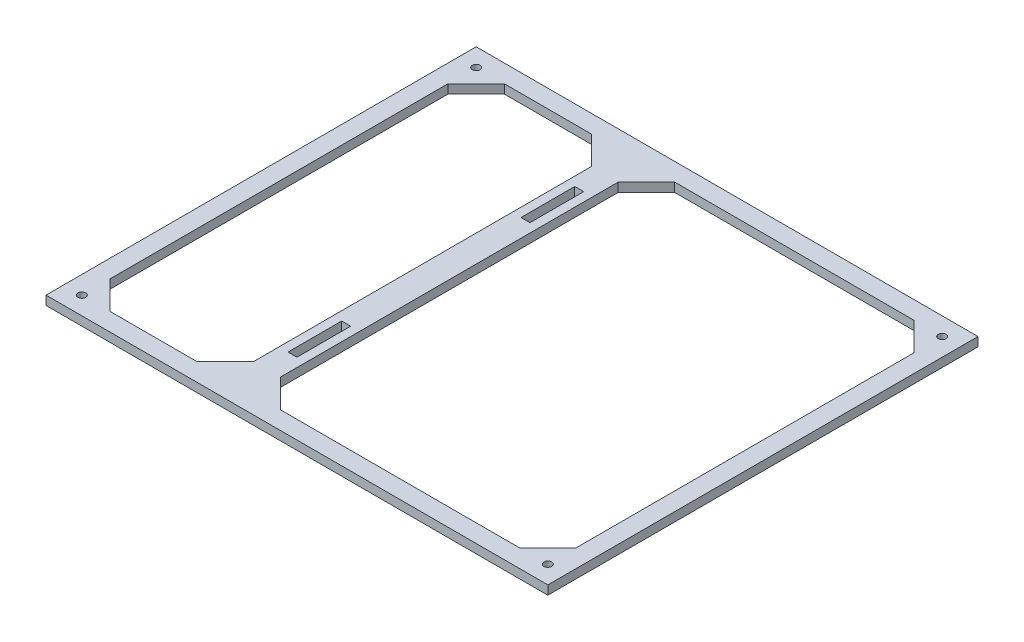
ISO-10303-21;
HEADER;
FILE_DESCRIPTION(('STEP AP214'),'2;1');
FILE_NAME('part.step','',(''),(''),'','','');
FILE_SCHEMA(('AUTOMOTIVE_DESIGN { 1 0 10303 214 1 1 1 1 }'));
ENDSEC;
DATA;
#1=APPLICATION_CONTEXT('core data for automotive mechanical design processes');
#2=APPLICATION_PROTOCOL_DEFINITION('international standard','automotive_design',2000,#1);
#3=PRODUCT_CONTEXT('',#1,'mechanical');
#4=PRODUCT('Part','Part','',(#3));
#5=PRODUCT_RELATED_PRODUCT_CATEGORY('part','',(#4));
#6=PRODUCT_DEFINITION_FORMATION('','',#4);
#7=PRODUCT_DEFINITION_CONTEXT('part definition',#1,'design');
#8=PRODUCT_DEFINITION('design','',#6,#7);
#9=PRODUCT_DEFINITION_SHAPE('','',#8);
#10=(LENGTH_UNIT() NAMED_UNIT(*) SI_UNIT(.MILLI.,.METRE.));
#11=(NAMED_UNIT(*) PLANE_ANGLE_UNIT() SI_UNIT($,.RADIAN.));
#12=(NAMED_UNIT(*) SI_UNIT($,.STERADIAN.) SOLID_ANGLE_UNIT());
#13=UNCERTAINTY_MEASURE_WITH_UNIT(LENGTH_MEASURE(1.E-05),#10,'distance_accuracy_value','');
#14=(GEOMETRIC_REPRESENTATION_CONTEXT(3) GLOBAL_UNCERTAINTY_ASSIGNED_CONTEXT((#13)) GLOBAL_UNIT_ASSIGNED_CONTEXT((#10,
#11,#12)) REPRESENTATION_CONTEXT('',''));
#15=CARTESIAN_POINT('',(0.,0.,0.));
#16=DIRECTION('',(0.,0.,1.));
#17=DIRECTION('',(1.,0.,0.));
#18=AXIS2_PLACEMENT_3D('',#15,#16,#17);
#19=CARTESIAN_POINT('',(0.,3.175,0.));
#20=DIRECTION('',(0.,-1.,0.));
#21=DIRECTION('',(0.,0.,-1.));
#22=AXIS2_PLACEMENT_3D('',#19,#20,#21);
#23=PLANE('',#22);
#24=CARTESIAN_POINT('',(6.35,3.175,-146.05));
#25=DIRECTION('',(0.,1.,0.));
#26=DIRECTION('',(0.,0.,1.));
#27=AXIS2_PLACEMENT_3D('',#24,#25,#26);
#28=CIRCLE('',#27,1.375);
#29=CARTESIAN_POINT('',(6.35,3.175,-144.675));
#30=VERTEX_POINT('',#29);
#31=EDGE_CURVE('E257',#30,#30,#28,.T.);
#32=ORIENTED_EDGE('',*,*,#31,.F.);
#33=EDGE_LOOP('',(#32));
#34=FACE_BOUND('',#33,.T.);
#35=DIRECTION('',(0.707106781186547,0.,0.707106781186548));
#36=VECTOR('',#35,1.);
#37=CARTESIAN_POINT('',(66.675,3.175,-16.35));
#38=LINE('',#37,#36);
#39=CARTESIAN_POINT('',(66.675,3.175,-16.35));
#40=VERTEX_POINT('',#39);
#41=CARTESIAN_POINT('',(76.675,3.175,-6.35000000000002));
#42=VERTEX_POINT('',#41);
#43=EDGE_CURVE('E263',#40,#42,#38,.T.);
#44=ORIENTED_EDGE('',*,*,#43,.F.);
#45=DIRECTION('',(0.,0.,1.));
#46=VECTOR('',#45,1.);
#47=CARTESIAN_POINT('',(66.675,3.175,-136.05));
#48=LINE('',#47,#46);
#49=CARTESIAN_POINT('',(66.675,3.175,-136.05));
#50=VERTEX_POINT('',#49);
#51=EDGE_CURVE('E279',#50,#40,#48,.T.);
#52=ORIENTED_EDGE('',*,*,#51,.F.);
#53=DIRECTION('',(-0.707106781186547,0.,0.707106781186549));
#54=VECTOR('',#53,1.);
#55=CARTESIAN_POINT('',(66.675,3.175,-136.05));
#56=LINE('',#55,#54);
#57=CARTESIAN_POINT('',(76.675,3.175,-146.05));
#58=VERTEX_POINT('',#57);
#59=EDGE_CURVE('E276',#58,#50,#56,.T.);
#60=ORIENTED_EDGE('',*,*,#59,.F.);
#61=DIRECTION('',(-1.,0.,0.));
#62=VECTOR('',#61,1.);
#63=CARTESIAN_POINT('',(76.675,3.175,-146.05));
#64=LINE('',#63,#62);
#65=CARTESIAN_POINT('',(161.45,3.175,-146.05));
#66=VERTEX_POINT('',#65);
#67=EDGE_CURVE('E274',#66,#58,#64,.T.);
#68=ORIENTED_EDGE('',*,*,#67,.F.);
#69=DIRECTION('',(-0.707106781186549,0.,-0.707106781186545));
#70=VECTOR('',#69,1.);
#71=CARTESIAN_POINT('',(161.45,3.175,-146.05));
#72=LINE('',#71,#70);
#73=CARTESIAN_POINT('',(171.45,3.175,-136.05));
#74=VERTEX_POINT('',#73);
#75=EDGE_CURVE('E272',#74,#66,#72,.T.);
#76=ORIENTED_EDGE('',*,*,#75,.F.);
#77=DIRECTION('',(0.,0.,-1.));
#78=VECTOR('',#77,1.);
#79=CARTESIAN_POINT('',(171.45,3.175,-136.05));
#80=LINE('',#79,#78);
#81=CARTESIAN_POINT('',(171.45,3.175,-16.35));
#82=VERTEX_POINT('',#81);
#83=EDGE_CURVE('E270',#82,#74,#80,.T.);
#84=ORIENTED_EDGE('',*,*,#83,.F.);
#85=DIRECTION('',(0.707106781186549,0.,-0.707106781186546));
#86=VECTOR('',#85,1.);
#87=CARTESIAN_POINT('',(161.45,3.175,-6.35000000000002));
#88=LINE('',#87,#86);
#89=CARTESIAN_POINT('',(161.45,3.175,-6.35000000000002));
#90=VERTEX_POINT('',#89);
#91=EDGE_CURVE('E268',#90,#82,#88,.T.);
#92=ORIENTED_EDGE('',*,*,#91,.F.);
#93=DIRECTION('',(1.,0.,0.));
#94=VECTOR('',#93,1.);
#95=CARTESIAN_POINT('',(76.675,3.175,-6.35000000000002));
#96=LINE('',#95,#94);
#97=EDGE_CURVE('E265',#42,#90,#96,.T.);
#98=ORIENTED_EDGE('',*,*,#97,.F.);
#99=EDGE_LOOP('',(#44,#52,#60,#68,#76,#84,#92,#98));
#100=FACE_BOUND('',#99,.T.);
#101=DIRECTION('',(0.,0.,1.));
#102=VECTOR('',#101,1.);
#103=CARTESIAN_POINT('',(60.325,3.175,-127.));
#104=LINE('',#103,#102);
#105=CARTESIAN_POINT('',(60.325,3.175,-127.));
#106=VERTEX_POINT('',#105);
#107=CARTESIAN_POINT('',(60.325,3.175,-107.95));
#108=VERTEX_POINT('',#107);
#109=EDGE_CURVE('E381',#106,#108,#104,.T.);
#110=ORIENTED_EDGE('',*,*,#109,.F.);
#111=DIRECTION('',(-1.,0.,0.));
#112=VECTOR('',#111,1.);
#113=CARTESIAN_POINT('',(60.325,3.175,-127.));
#114=LINE('',#113,#112);
#115=CARTESIAN_POINT('',(63.5,3.175,-127.));
#116=VERTEX_POINT('',#115);
#117=EDGE_CURVE('E389',#116,#106,#114,.T.);
#118=ORIENTED_EDGE('',*,*,#117,.F.);
#119=DIRECTION('',(0.,0.,-1.));
#120=VECTOR('',#119,1.);
#121=CARTESIAN_POINT('',(63.5,3.175,-127.));
#122=LINE('',#121,#120);
#123=CARTESIAN_POINT('',(63.5,3.175,-107.95));
#124=VERTEX_POINT('',#123);
#125=EDGE_CURVE('E386',#124,#116,#122,.T.);
#126=ORIENTED_EDGE('',*,*,#125,.F.);
#127=DIRECTION('',(1.,0.,0.));
#128=VECTOR('',#127,1.);
#129=CARTESIAN_POINT('',(60.325,3.175,-107.95));
#130=LINE('',#129,#128);
#131=EDGE_CURVE('E383',#108,#124,#130,.T.);
#132=ORIENTED_EDGE('',*,*,#131,.F.);
#133=EDGE_LOOP('',(#110,#118,#126,#132));
#134=FACE_BOUND('',#133,.T.);
#135=DIRECTION('',(0.,0.,1.));
#136=VECTOR('',#135,1.);
#137=CARTESIAN_POINT('',(0.,3.175,0.));
#138=LINE('',#137,#136);
#139=CARTESIAN_POINT('',(0.,3.175,-152.4));
#140=VERTEX_POINT('',#139);
#141=CARTESIAN_POINT('',(0.,3.175,0.));
#142=VERTEX_POINT('',#141);
#143=EDGE_CURVE('E412',#140,#142,#138,.T.);
#144=ORIENTED_EDGE('',*,*,#143,.T.);
#145=DIRECTION('',(1.,0.,0.));
#146=VECTOR('',#145,1.);
#147=CARTESIAN_POINT('',(0.,3.175,0.));
#148=LINE('',#147,#146);
#149=CARTESIAN_POINT('',(177.8,3.175,0.));
#150=VERTEX_POINT('',#149);
#151=EDGE_CURVE('E415',#142,#150,#148,.T.);
#152=ORIENTED_EDGE('',*,*,#151,.T.);
#153=DIRECTION('',(0.,0.,-1.));
#154=VECTOR('',#153,1.);
#155=CARTESIAN_POINT('',(177.8,3.175,0.));
#156=LINE('',#155,#154);
#157=CARTESIAN_POINT('',(177.8,3.175,-152.4));
#158=VERTEX_POINT('',#157);
#159=EDGE_CURVE('E418',#150,#158,#156,.T.);
#160=ORIENTED_EDGE('',*,*,#159,.T.);
#161=DIRECTION('',(-1.,0.,0.));
#162=VECTOR('',#161,1.);
#163=CARTESIAN_POINT('',(0.,3.175,-152.4));
#164=LINE('',#163,#162);
#165=EDGE_CURVE('E420',#158,#140,#164,.T.);
#166=ORIENTED_EDGE('',*,*,#165,.T.);
#167=EDGE_LOOP('',(#144,#152,#160,#166));
#168=FACE_BOUND('',#167,.T.);
#169=DIRECTION('',(0.,0.,1.));
#170=VECTOR('',#169,1.);
#171=CARTESIAN_POINT('',(6.35,3.175,-136.05));
#172=LINE('',#171,#170);
#173=CARTESIAN_POINT('',(6.35,3.175,-136.05));
#174=VERTEX_POINT('',#173);
#175=CARTESIAN_POINT('',(6.35000000000002,3.175,-16.35));
#176=VERTEX_POINT('',#175);
#177=EDGE_CURVE('E322',#174,#176,#172,.T.);
#178=ORIENTED_EDGE('',*,*,#177,.F.);
#179=DIRECTION('',(-0.707106781186547,0.,0.707106781186548));
#180=VECTOR('',#179,1.);
#181=CARTESIAN_POINT('',(6.35,3.175,-136.05));
#182=LINE('',#181,#180);
#183=CARTESIAN_POINT('',(16.35,3.175,-146.05));
#184=VERTEX_POINT('',#183);
#185=EDGE_CURVE('E338',#184,#174,#182,.T.);
#186=ORIENTED_EDGE('',*,*,#185,.F.);
#187=DIRECTION('',(-1.,0.,0.));
#188=VECTOR('',#187,1.);
#189=CARTESIAN_POINT('',(16.35,3.175,-146.05));
#190=LINE('',#189,#188);
#191=CARTESIAN_POINT('',(47.15,3.175,-146.05));
#192=VERTEX_POINT('',#191);
#193=EDGE_CURVE('E335',#192,#184,#190,.T.);
#194=ORIENTED_EDGE('',*,*,#193,.F.);
#195=DIRECTION('',(-0.707106781186547,0.,-0.707106781186547));
#196=VECTOR('',#195,1.);
#197=CARTESIAN_POINT('',(47.15,3.175,-146.05));
#198=LINE('',#197,#196);
#199=CARTESIAN_POINT('',(57.15,3.175,-136.05));
#200=VERTEX_POINT('',#199);
#201=EDGE_CURVE('E333',#200,#192,#198,.T.);
#202=ORIENTED_EDGE('',*,*,#201,.F.);
#203=DIRECTION('',(0.,0.,-1.));
#204=VECTOR('',#203,1.);
#205=CARTESIAN_POINT('',(57.15,3.175,-136.05));
#206=LINE('',#205,#204);
#207=CARTESIAN_POINT('',(57.15,3.175,-16.35));
#208=VERTEX_POINT('',#207);
#209=EDGE_CURVE('E331',#208,#200,#206,.T.);
#210=ORIENTED_EDGE('',*,*,#209,.F.);
#211=DIRECTION('',(0.707106781186548,0.,-0.707106781186548));
#212=VECTOR('',#211,1.);
#213=CARTESIAN_POINT('',(47.15,3.175,-6.35000000000002));
#214=LINE('',#213,#212);
#215=CARTESIAN_POINT('',(47.15,3.175,-6.35000000000002));
#216=VERTEX_POINT('',#215);
#217=EDGE_CURVE('E329',#216,#208,#214,.T.);
#218=ORIENTED_EDGE('',*,*,#217,.F.);
#219=DIRECTION('',(1.,0.,0.));
#220=VECTOR('',#219,1.);
#221=CARTESIAN_POINT('',(16.35,3.175,-6.35000000000002));
#222=LINE('',#221,#220);
#223=CARTESIAN_POINT('',(16.35,3.175,-6.35000000000002));
#224=VERTEX_POINT('',#223);
#225=EDGE_CURVE('E327',#224,#216,#222,.T.);
#226=ORIENTED_EDGE('',*,*,#225,.F.);
#227=DIRECTION('',(0.707106781186548,0.,0.707106781186548));
#228=VECTOR('',#227,1.);
#229=CARTESIAN_POINT('',(6.35000000000002,3.175,-16.35));
#230=LINE('',#229,#228);
#231=EDGE_CURVE('E324',#176,#224,#230,.T.);
#232=ORIENTED_EDGE('',*,*,#231,.F.);
#233=EDGE_LOOP('',(#178,#186,#194,#202,#210,#218,#226,#232));
#234=FACE_BOUND('',#233,.T.);
#235=DIRECTION('',(0.,0.,1.));
#236=VECTOR('',#235,1.);
#237=CARTESIAN_POINT('',(60.325,3.175,-25.4));
#238=LINE('',#237,#236);
#239=CARTESIAN_POINT('',(60.325,3.175,-44.45));
#240=VERTEX_POINT('',#239);
#241=CARTESIAN_POINT('',(60.325,3.175,-25.4));
#242=VERTEX_POINT('',#241);
#243=EDGE_CURVE('E218',#240,#242,#238,.T.);
#244=ORIENTED_EDGE('',*,*,#243,.F.);
#245=DIRECTION('',(-1.,0.,0.));
#246=VECTOR('',#245,1.);
#247=CARTESIAN_POINT('',(60.325,3.175,-44.45));
#248=LINE('',#247,#246);
#249=CARTESIAN_POINT('',(63.5,3.175,-44.45));
#250=VERTEX_POINT('',#249);
#251=EDGE_CURVE('E241',#250,#240,#248,.T.);
#252=ORIENTED_EDGE('',*,*,#251,.F.);
#253=DIRECTION('',(0.,0.,-1.));
#254=VECTOR('',#253,1.);
#255=CARTESIAN_POINT('',(63.5,3.175,-25.4));
#256=LINE('',#255,#254);
#257=CARTESIAN_POINT('',(63.5,3.175,-25.4));
#258=VERTEX_POINT('',#257);
#259=EDGE_CURVE('E239',#258,#250,#256,.T.);
#260=ORIENTED_EDGE('',*,*,#259,.F.);
#261=DIRECTION('',(1.,0.,0.));
#262=VECTOR('',#261,1.);
#263=CARTESIAN_POINT('',(60.325,3.175,-25.4));
#264=LINE('',#263,#262);
#265=EDGE_CURVE('E226',#242,#258,#264,.T.);
#266=ORIENTED_EDGE('',*,*,#265,.F.);
#267=EDGE_LOOP('',(#244,#252,#260,#266));
#268=FACE_BOUND('',#267,.T.);
#269=CARTESIAN_POINT('',(6.35000000000002,3.175,-6.35000000000002));
#270=DIRECTION('',(0.,1.,0.));
#271=DIRECTION('',(0.,0.,1.));
#272=AXIS2_PLACEMENT_3D('',#269,#270,#271);
#273=CIRCLE('',#272,1.375);
#274=CARTESIAN_POINT('',(6.35000000000002,3.175,-4.97500000000002));
#275=VERTEX_POINT('',#274);
#276=EDGE_CURVE('E247',#275,#275,#273,.T.);
#277=ORIENTED_EDGE('',*,*,#276,.F.);
#278=EDGE_LOOP('',(#277));
#279=FACE_BOUND('',#278,.T.);
#280=CARTESIAN_POINT('',(171.45,3.175,-6.35000000000002));
#281=DIRECTION('',(0.,1.,0.));
#282=DIRECTION('',(0.,0.,1.));
#283=AXIS2_PLACEMENT_3D('',#280,#281,#282);
#284=CIRCLE('',#283,1.37499999999999);
#285=CARTESIAN_POINT('',(171.45,3.175,-4.97500000000003));
#286=VERTEX_POINT('',#285);
#287=EDGE_CURVE('E613',#286,#286,#284,.T.);
#288=ORIENTED_EDGE('',*,*,#287,.F.);
#289=EDGE_LOOP('',(#288));
#290=FACE_BOUND('',#289,.T.);
#291=CARTESIAN_POINT('',(171.45,3.175,-146.05));
#292=DIRECTION('',(0.,1.,0.));
#293=DIRECTION('',(0.,0.,1.));
#294=AXIS2_PLACEMENT_3D('',#291,#292,#293);
#295=CIRCLE('',#294,1.37499999999999);
#296=CARTESIAN_POINT('',(171.45,3.175,-144.675));
#297=VERTEX_POINT('',#296);
#298=EDGE_CURVE('E604',#297,#297,#295,.T.);
#299=ORIENTED_EDGE('',*,*,#298,.F.);
#300=EDGE_LOOP('',(#299));
#301=FACE_BOUND('',#300,.T.);
#302=ADVANCED_FACE('F33',(#34,#100,#134,#168,#234,#268,#279,#290,#301),#23,.F.);
#303=CARTESIAN_POINT('',(0.,0.,0.));
#304=DIRECTION('',(0.,-1.,0.));
#305=DIRECTION('',(0.,0.,-1.));
#306=AXIS2_PLACEMENT_3D('',#303,#304,#305);
#307=PLANE('',#306);
#308=CARTESIAN_POINT('',(171.45,0.,-6.35000000000002));
#309=DIRECTION('',(0.,1.,0.));
#310=DIRECTION('',(0.,0.,1.));
#311=AXIS2_PLACEMENT_3D('',#308,#309,#310);
#312=CIRCLE('',#311,1.37499999999999);
#313=CARTESIAN_POINT('',(171.45,0.,-4.97500000000003));
#314=VERTEX_POINT('',#313);
#315=EDGE_CURVE('E610',#314,#314,#312,.T.);
#316=ORIENTED_EDGE('',*,*,#315,.T.);
#317=EDGE_LOOP('',(#316));
#318=FACE_BOUND('',#317,.T.);
#319=DIRECTION('',(-1.,0.,0.));
#320=VECTOR('',#319,1.);
#321=CARTESIAN_POINT('',(60.325,0.,-44.45));
#322=LINE('',#321,#320);
#323=CARTESIAN_POINT('',(63.5,0.,-44.45));
#324=VERTEX_POINT('',#323);
#325=CARTESIAN_POINT('',(60.325,0.,-44.45));
#326=VERTEX_POINT('',#325);
#327=EDGE_CURVE('E227',#324,#326,#322,.T.);
#328=ORIENTED_EDGE('',*,*,#327,.T.);
#329=DIRECTION('',(0.,0.,1.));
#330=VECTOR('',#329,1.);
#331=CARTESIAN_POINT('',(60.325,0.,-25.4));
#332=LINE('',#331,#330);
#333=CARTESIAN_POINT('',(60.325,0.,-25.4));
#334=VERTEX_POINT('',#333);
#335=EDGE_CURVE('E56',#326,#334,#332,.T.);
#336=ORIENTED_EDGE('',*,*,#335,.T.);
#337=DIRECTION('',(1.,0.,0.));
#338=VECTOR('',#337,1.);
#339=CARTESIAN_POINT('',(60.325,0.,-25.4));
#340=LINE('',#339,#338);
#341=CARTESIAN_POINT('',(63.5,0.,-25.4));
#342=VERTEX_POINT('',#341);
#343=EDGE_CURVE('E233',#334,#342,#340,.T.);
#344=ORIENTED_EDGE('',*,*,#343,.T.);
#345=DIRECTION('',(0.,0.,-1.));
#346=VECTOR('',#345,1.);
#347=CARTESIAN_POINT('',(63.5,0.,-25.4));
#348=LINE('',#347,#346);
#349=EDGE_CURVE('E249',#342,#324,#348,.T.);
#350=ORIENTED_EDGE('',*,*,#349,.T.);
#351=EDGE_LOOP('',(#328,#336,#344,#350));
#352=FACE_BOUND('',#351,.T.);
#353=CARTESIAN_POINT('',(6.35,0.,-146.05));
#354=DIRECTION('',(0.,1.,0.));
#355=DIRECTION('',(0.,0.,1.));
#356=AXIS2_PLACEMENT_3D('',#353,#354,#355);
#357=CIRCLE('',#356,1.375);
#358=CARTESIAN_POINT('',(6.35,0.,-144.675));
#359=VERTEX_POINT('',#358);
#360=EDGE_CURVE('E234',#359,#359,#357,.T.);
#361=ORIENTED_EDGE('',*,*,#360,.T.);
#362=EDGE_LOOP('',(#361));
#363=FACE_BOUND('',#362,.T.);
#364=DIRECTION('',(0.,0.,1.));
#365=VECTOR('',#364,1.);
#366=CARTESIAN_POINT('',(0.,0.,0.));
#367=LINE('',#366,#365);
#368=CARTESIAN_POINT('',(0.,0.,-152.4));
#369=VERTEX_POINT('',#368);
#370=CARTESIAN_POINT('',(0.,0.,0.));
#371=VERTEX_POINT('',#370);
#372=EDGE_CURVE('E411',#369,#371,#367,.T.);
#373=ORIENTED_EDGE('',*,*,#372,.F.);
#374=DIRECTION('',(-1.,0.,0.));
#375=VECTOR('',#374,1.);
#376=CARTESIAN_POINT('',(0.,0.,-152.4));
#377=LINE('',#376,#375);
#378=CARTESIAN_POINT('',(177.8,0.,-152.4));
#379=VERTEX_POINT('',#378);
#380=EDGE_CURVE('E416',#379,#369,#377,.T.);
#381=ORIENTED_EDGE('',*,*,#380,.F.);
#382=DIRECTION('',(0.,0.,-1.));
#383=VECTOR('',#382,1.);
#384=CARTESIAN_POINT('',(177.8,0.,0.));
#385=LINE('',#384,#383);
#386=CARTESIAN_POINT('',(177.8,0.,0.));
#387=VERTEX_POINT('',#386);
#388=EDGE_CURVE('E427',#387,#379,#385,.T.);
#389=ORIENTED_EDGE('',*,*,#388,.F.);
#390=DIRECTION('',(1.,0.,0.));
#391=VECTOR('',#390,1.);
#392=CARTESIAN_POINT('',(0.,0.,0.));
#393=LINE('',#392,#391);
#394=EDGE_CURVE('E425',#371,#387,#393,.T.);
#395=ORIENTED_EDGE('',*,*,#394,.F.);
#396=EDGE_LOOP('',(#373,#381,#389,#395));
#397=FACE_BOUND('',#396,.T.);
#398=DIRECTION('',(-1.,0.,0.));
#399=VECTOR('',#398,1.);
#400=CARTESIAN_POINT('',(60.325,0.,-127.));
#401=LINE('',#400,#399);
#402=CARTESIAN_POINT('',(63.5,0.,-127.));
#403=VERTEX_POINT('',#402);
#404=CARTESIAN_POINT('',(60.325,0.,-127.));
#405=VERTEX_POINT('',#404);
#406=EDGE_CURVE('E384',#403,#405,#401,.T.);
#407=ORIENTED_EDGE('',*,*,#406,.T.);
#408=DIRECTION('',(0.,0.,1.));
#409=VECTOR('',#408,1.);
#410=CARTESIAN_POINT('',(60.325,0.,-127.));
#411=LINE('',#410,#409);
#412=CARTESIAN_POINT('',(60.325,0.,-107.95));
#413=VERTEX_POINT('',#412);
#414=EDGE_CURVE('E380',#405,#413,#411,.T.);
#415=ORIENTED_EDGE('',*,*,#414,.T.);
#416=DIRECTION('',(1.,0.,0.));
#417=VECTOR('',#416,1.);
#418=CARTESIAN_POINT('',(60.325,0.,-107.95));
#419=LINE('',#418,#417);
#420=CARTESIAN_POINT('',(63.5,0.,-107.95));
#421=VERTEX_POINT('',#420);
#422=EDGE_CURVE('E394',#413,#421,#419,.T.);
#423=ORIENTED_EDGE('',*,*,#422,.T.);
#424=DIRECTION('',(0.,0.,-1.));
#425=VECTOR('',#424,1.);
#426=CARTESIAN_POINT('',(63.5,0.,-127.));
#427=LINE('',#426,#425);
#428=EDGE_CURVE('E397',#421,#403,#427,.T.);
#429=ORIENTED_EDGE('',*,*,#428,.T.);
#430=EDGE_LOOP('',(#407,#415,#423,#429));
#431=FACE_BOUND('',#430,.T.);
#432=DIRECTION('',(-0.707106781186547,0.,0.707106781186548));
#433=VECTOR('',#432,1.);
#434=CARTESIAN_POINT('',(6.35,0.,-136.05));
#435=LINE('',#434,#433);
#436=CARTESIAN_POINT('',(16.35,0.,-146.05));
#437=VERTEX_POINT('',#436);
#438=CARTESIAN_POINT('',(6.35000000000002,0.,-136.05));
#439=VERTEX_POINT('',#438);
#440=EDGE_CURVE('E325',#437,#439,#435,.T.);
#441=ORIENTED_EDGE('',*,*,#440,.T.);
#442=DIRECTION('',(0.,0.,1.));
#443=VECTOR('',#442,1.);
#444=CARTESIAN_POINT('',(6.35,0.,-136.05));
#445=LINE('',#444,#443);
#446=CARTESIAN_POINT('',(6.35000000000002,0.,-16.35));
#447=VERTEX_POINT('',#446);
#448=EDGE_CURVE('E321',#439,#447,#445,.T.);
#449=ORIENTED_EDGE('',*,*,#448,.T.);
#450=DIRECTION('',(0.707106781186548,0.,0.707106781186548));
#451=VECTOR('',#450,1.);
#452=CARTESIAN_POINT('',(6.35000000000002,0.,-16.35));
#453=LINE('',#452,#451);
#454=CARTESIAN_POINT('',(16.35,0.,-6.35000000000002));
#455=VERTEX_POINT('',#454);
#456=EDGE_CURVE('E343',#447,#455,#453,.T.);
#457=ORIENTED_EDGE('',*,*,#456,.T.);
#458=DIRECTION('',(1.,0.,0.));
#459=VECTOR('',#458,1.);
#460=CARTESIAN_POINT('',(16.35,0.,-6.35000000000002));
#461=LINE('',#460,#459);
#462=CARTESIAN_POINT('',(47.15,0.,-6.35000000000002));
#463=VERTEX_POINT('',#462);
#464=EDGE_CURVE('E346',#455,#463,#461,.T.);
#465=ORIENTED_EDGE('',*,*,#464,.T.);
#466=DIRECTION('',(0.707106781186548,0.,-0.707106781186548));
#467=VECTOR('',#466,1.);
#468=CARTESIAN_POINT('',(47.15,0.,-6.35000000000002));
#469=LINE('',#468,#467);
#470=CARTESIAN_POINT('',(57.15,0.,-16.35));
#471=VERTEX_POINT('',#470);
#472=EDGE_CURVE('E349',#463,#471,#469,.T.);
#473=ORIENTED_EDGE('',*,*,#472,.T.);
#474=DIRECTION('',(0.,0.,-1.));
#475=VECTOR('',#474,1.);
#476=CARTESIAN_POINT('',(57.15,0.,-136.05));
#477=LINE('',#476,#475);
#478=CARTESIAN_POINT('',(57.15,0.,-136.05));
#479=VERTEX_POINT('',#478);
#480=EDGE_CURVE('E352',#471,#479,#477,.T.);
#481=ORIENTED_EDGE('',*,*,#480,.T.);
#482=DIRECTION('',(-0.707106781186547,0.,-0.707106781186547));
#483=VECTOR('',#482,1.);
#484=CARTESIAN_POINT('',(47.15,0.,-146.05));
#485=LINE('',#484,#483);
#486=CARTESIAN_POINT('',(47.15,0.,-146.05));
#487=VERTEX_POINT('',#486);
#488=EDGE_CURVE('E355',#479,#487,#485,.T.);
#489=ORIENTED_EDGE('',*,*,#488,.T.);
#490=DIRECTION('',(-1.,0.,0.));
#491=VECTOR('',#490,1.);
#492=CARTESIAN_POINT('',(16.35,0.,-146.05));
#493=LINE('',#492,#491);
#494=EDGE_CURVE('E358',#487,#437,#493,.T.);
#495=ORIENTED_EDGE('',*,*,#494,.T.);
#496=EDGE_LOOP('',(#441,#449,#457,#465,#473,#481,#489,#495));
#497=FACE_BOUND('',#496,.T.);
#498=DIRECTION('',(0.,0.,1.));
#499=VECTOR('',#498,1.);
#500=CARTESIAN_POINT('',(66.675,0.,-136.05));
#501=LINE('',#500,#499);
#502=CARTESIAN_POINT('',(66.675,0.,-136.05));
#503=VERTEX_POINT('',#502);
#504=CARTESIAN_POINT('',(66.675,0.,-16.35));
#505=VERTEX_POINT('',#504);
#506=EDGE_CURVE('E266',#503,#505,#501,.T.);
#507=ORIENTED_EDGE('',*,*,#506,.T.);
#508=DIRECTION('',(0.707106781186547,0.,0.707106781186548));
#509=VECTOR('',#508,1.);
#510=CARTESIAN_POINT('',(66.675,0.,-16.35));
#511=LINE('',#510,#509);
#512=CARTESIAN_POINT('',(76.675,0.,-6.35000000000002));
#513=VERTEX_POINT('',#512);
#514=EDGE_CURVE('E260',#505,#513,#511,.T.);
#515=ORIENTED_EDGE('',*,*,#514,.T.);
#516=DIRECTION('',(1.,0.,0.));
#517=VECTOR('',#516,1.);
#518=CARTESIAN_POINT('',(76.675,0.,-6.35000000000002));
#519=LINE('',#518,#517);
#520=CARTESIAN_POINT('',(161.45,0.,-6.35000000000002));
#521=VERTEX_POINT('',#520);
#522=EDGE_CURVE('E284',#513,#521,#519,.T.);
#523=ORIENTED_EDGE('',*,*,#522,.T.);
#524=DIRECTION('',(0.707106781186549,0.,-0.707106781186546));
#525=VECTOR('',#524,1.);
#526=CARTESIAN_POINT('',(161.45,0.,-6.35000000000002));
#527=LINE('',#526,#525);
#528=CARTESIAN_POINT('',(171.45,0.,-16.35));
#529=VERTEX_POINT('',#528);
#530=EDGE_CURVE('E287',#521,#529,#527,.T.);
#531=ORIENTED_EDGE('',*,*,#530,.T.);
#532=DIRECTION('',(0.,0.,-1.));
#533=VECTOR('',#532,1.);
#534=CARTESIAN_POINT('',(171.45,0.,-136.05));
#535=LINE('',#534,#533);
#536=CARTESIAN_POINT('',(171.45,0.,-136.05));
#537=VERTEX_POINT('',#536);
#538=EDGE_CURVE('E290',#529,#537,#535,.T.);
#539=ORIENTED_EDGE('',*,*,#538,.T.);
#540=DIRECTION('',(-0.707106781186549,0.,-0.707106781186545));
#541=VECTOR('',#540,1.);
#542=CARTESIAN_POINT('',(161.45,0.,-146.05));
#543=LINE('',#542,#541);
#544=CARTESIAN_POINT('',(161.45,0.,-146.05));
#545=VERTEX_POINT('',#544);
#546=EDGE_CURVE('E293',#537,#545,#543,.T.);
#547=ORIENTED_EDGE('',*,*,#546,.T.);
#548=DIRECTION('',(-1.,0.,0.));
#549=VECTOR('',#548,1.);
#550=CARTESIAN_POINT('',(76.675,0.,-146.05));
#551=LINE('',#550,#549);
#552=CARTESIAN_POINT('',(76.675,0.,-146.05));
#553=VERTEX_POINT('',#552);
#554=EDGE_CURVE('E296',#545,#553,#551,.T.);
#555=ORIENTED_EDGE('',*,*,#554,.T.);
#556=DIRECTION('',(-0.707106781186547,0.,0.707106781186549));
#557=VECTOR('',#556,1.);
#558=CARTESIAN_POINT('',(66.675,0.,-136.05));
#559=LINE('',#558,#557);
#560=EDGE_CURVE('E299',#553,#503,#559,.T.);
#561=ORIENTED_EDGE('',*,*,#560,.T.);
#562=EDGE_LOOP('',(#507,#515,#523,#531,#539,#547,#555,#561));
#563=FACE_BOUND('',#562,.T.);
#564=CARTESIAN_POINT('',(6.35000000000002,0.,-6.35000000000002));
#565=DIRECTION('',(0.,1.,0.));
#566=DIRECTION('',(0.,0.,1.));
#567=AXIS2_PLACEMENT_3D('',#564,#565,#566);
#568=CIRCLE('',#567,1.375);
#569=CARTESIAN_POINT('',(6.35000000000002,0.,-4.97500000000002));
#570=VERTEX_POINT('',#569);
#571=EDGE_CURVE('E616',#570,#570,#568,.T.);
#572=ORIENTED_EDGE('',*,*,#571,.T.);
#573=EDGE_LOOP('',(#572));
#574=FACE_BOUND('',#573,.T.);
#575=CARTESIAN_POINT('',(171.45,0.,-146.05));
#576=DIRECTION('',(0.,1.,0.));
#577=DIRECTION('',(0.,0.,1.));
#578=AXIS2_PLACEMENT_3D('',#575,#576,#577);
#579=CIRCLE('',#578,1.37499999999999);
#580=CARTESIAN_POINT('',(171.45,0.,-144.675));
#581=VERTEX_POINT('',#580);
#582=EDGE_CURVE('E607',#581,#581,#579,.T.);
#583=ORIENTED_EDGE('',*,*,#582,.T.);
#584=EDGE_LOOP('',(#583));
#585=FACE_BOUND('',#584,.T.);
#586=ADVANCED_FACE('F445',(#318,#352,#363,#397,#431,#497,#563,#574,#585),#307,.T.);
#587=CARTESIAN_POINT('',(0.,3.175,0.));
#588=DIRECTION('',(1.,0.,0.));
#589=DIRECTION('',(0.,0.,-1.));
#590=AXIS2_PLACEMENT_3D('',#587,#588,#589);
#591=PLANE('',#590);
#592=ORIENTED_EDGE('',*,*,#372,.T.);
#593=DIRECTION('',(0.,-1.,0.));
#594=VECTOR('',#593,1.);
#595=CARTESIAN_POINT('',(0.,3.175,0.));
#596=LINE('',#595,#594);
#597=EDGE_CURVE('E11',#142,#371,#596,.T.);
#598=ORIENTED_EDGE('',*,*,#597,.F.);
#599=ORIENTED_EDGE('',*,*,#143,.F.);
#600=DIRECTION('',(0.,-1.,0.));
#601=VECTOR('',#600,1.);
#602=CARTESIAN_POINT('',(0.,3.175,-152.4));
#603=LINE('',#602,#601);
#604=EDGE_CURVE('E422',#140,#369,#603,.T.);
#605=ORIENTED_EDGE('',*,*,#604,.T.);
#606=EDGE_LOOP('',(#592,#598,#599,#605));
#607=FACE_BOUND('',#606,.T.);
#608=ADVANCED_FACE('F35',(#607),#591,.F.);
#609=CARTESIAN_POINT('',(0.,3.175,0.));
#610=DIRECTION('',(0.,0.,-1.));
#611=DIRECTION('',(-1.,0.,0.));
#612=AXIS2_PLACEMENT_3D('',#609,#610,#611);
#613=PLANE('',#612);
#614=ORIENTED_EDGE('',*,*,#394,.T.);
#615=DIRECTION('',(0.,-1.,0.));
#616=VECTOR('',#615,1.);
#617=CARTESIAN_POINT('',(177.8,3.175,0.));
#618=LINE('',#617,#616);
#619=EDGE_CURVE('E41',#150,#387,#618,.T.);
#620=ORIENTED_EDGE('',*,*,#619,.F.);
#621=ORIENTED_EDGE('',*,*,#151,.F.);
#622=ORIENTED_EDGE('',*,*,#597,.T.);
#623=EDGE_LOOP('',(#614,#620,#621,#622));
#624=FACE_BOUND('',#623,.T.);
#625=ADVANCED_FACE('F456',(#624),#613,.F.);
#626=CARTESIAN_POINT('',(177.8,3.175,0.));
#627=DIRECTION('',(-1.,0.,0.));
#628=DIRECTION('',(0.,0.,1.));
#629=AXIS2_PLACEMENT_3D('',#626,#627,#628);
#630=PLANE('',#629);
#631=ORIENTED_EDGE('',*,*,#388,.T.);
#632=DIRECTION('',(0.,-1.,0.));
#633=VECTOR('',#632,1.);
#634=CARTESIAN_POINT('',(177.8,3.175,-152.4));
#635=LINE('',#634,#633);
#636=EDGE_CURVE('E432',#158,#379,#635,.T.);
#637=ORIENTED_EDGE('',*,*,#636,.F.);
#638=ORIENTED_EDGE('',*,*,#159,.F.);
#639=ORIENTED_EDGE('',*,*,#619,.T.);
#640=EDGE_LOOP('',(#631,#637,#638,#639));
#641=FACE_BOUND('',#640,.T.);
#642=ADVANCED_FACE('F439',(#641),#630,.F.);
#643=CARTESIAN_POINT('',(0.,3.175,-152.4));
#644=DIRECTION('',(0.,0.,1.));
#645=DIRECTION('',(1.,0.,0.));
#646=AXIS2_PLACEMENT_3D('',#643,#644,#645);
#647=PLANE('',#646);
#648=ORIENTED_EDGE('',*,*,#380,.T.);
#649=ORIENTED_EDGE('',*,*,#604,.F.);
#650=ORIENTED_EDGE('',*,*,#165,.F.);
#651=ORIENTED_EDGE('',*,*,#636,.T.);
#652=EDGE_LOOP('',(#648,#649,#650,#651));
#653=FACE_BOUND('',#652,.T.);
#654=ADVANCED_FACE('F449',(#653),#647,.F.);
#655=CARTESIAN_POINT('',(60.325,3.175,-127.));
#656=DIRECTION('',(1.,0.,0.));
#657=DIRECTION('',(0.,0.,-1.));
#658=AXIS2_PLACEMENT_3D('',#655,#656,#657);
#659=PLANE('',#658);
#660=ORIENTED_EDGE('',*,*,#414,.F.);
#661=DIRECTION('',(0.,-1.,0.));
#662=VECTOR('',#661,1.);
#663=CARTESIAN_POINT('',(60.325,3.175,-127.));
#664=LINE('',#663,#662);
#665=EDGE_CURVE('E391',#106,#405,#664,.T.);
#666=ORIENTED_EDGE('',*,*,#665,.F.);
#667=ORIENTED_EDGE('',*,*,#109,.T.);
#668=DIRECTION('',(0.,-1.,0.));
#669=VECTOR('',#668,1.);
#670=CARTESIAN_POINT('',(60.325,3.175,-107.95));
#671=LINE('',#670,#669);
#672=EDGE_CURVE('E408',#108,#413,#671,.T.);
#673=ORIENTED_EDGE('',*,*,#672,.T.);
#674=EDGE_LOOP('',(#660,#666,#667,#673));
#675=FACE_BOUND('',#674,.T.);
#676=ADVANCED_FACE('F474',(#675),#659,.T.);
#677=CARTESIAN_POINT('',(60.325,3.175,-107.95));
#678=DIRECTION('',(0.,0.,-1.));
#679=DIRECTION('',(-1.,0.,0.));
#680=AXIS2_PLACEMENT_3D('',#677,#678,#679);
#681=PLANE('',#680);
#682=ORIENTED_EDGE('',*,*,#422,.F.);
#683=ORIENTED_EDGE('',*,*,#672,.F.);
#684=ORIENTED_EDGE('',*,*,#131,.T.);
#685=DIRECTION('',(0.,-1.,0.));
#686=VECTOR('',#685,1.);
#687=CARTESIAN_POINT('',(63.5,3.175,-107.95));
#688=LINE('',#687,#686);
#689=EDGE_CURVE('E406',#124,#421,#688,.T.);
#690=ORIENTED_EDGE('',*,*,#689,.T.);
#691=EDGE_LOOP('',(#682,#683,#684,#690));
#692=FACE_BOUND('',#691,.T.);
#693=ADVANCED_FACE('F481',(#692),#681,.T.);
#694=CARTESIAN_POINT('',(63.5,3.175,-127.));
#695=DIRECTION('',(-1.,0.,0.));
#696=DIRECTION('',(0.,0.,1.));
#697=AXIS2_PLACEMENT_3D('',#694,#695,#696);
#698=PLANE('',#697);
#699=ORIENTED_EDGE('',*,*,#428,.F.);
#700=ORIENTED_EDGE('',*,*,#689,.F.);
#701=ORIENTED_EDGE('',*,*,#125,.T.);
#702=DIRECTION('',(0.,-1.,0.));
#703=VECTOR('',#702,1.);
#704=CARTESIAN_POINT('',(63.5,3.175,-127.));
#705=LINE('',#704,#703);
#706=EDGE_CURVE('E404',#116,#403,#705,.T.);
#707=ORIENTED_EDGE('',*,*,#706,.T.);
#708=EDGE_LOOP('',(#699,#700,#701,#707));
#709=FACE_BOUND('',#708,.T.);
#710=ADVANCED_FACE('F486',(#709),#698,.T.);
#711=CARTESIAN_POINT('',(60.325,3.175,-127.));
#712=DIRECTION('',(0.,0.,1.));
#713=DIRECTION('',(1.,0.,0.));
#714=AXIS2_PLACEMENT_3D('',#711,#712,#713);
#715=PLANE('',#714);
#716=ORIENTED_EDGE('',*,*,#406,.F.);
#717=ORIENTED_EDGE('',*,*,#706,.F.);
#718=ORIENTED_EDGE('',*,*,#117,.T.);
#719=ORIENTED_EDGE('',*,*,#665,.T.);
#720=EDGE_LOOP('',(#716,#717,#718,#719));
#721=FACE_BOUND('',#720,.T.);
#722=ADVANCED_FACE('F493',(#721),#715,.T.);
#723=CARTESIAN_POINT('',(6.35,3.175,-136.05));
#724=DIRECTION('',(1.,0.,0.));
#725=DIRECTION('',(0.,0.,-1.));
#726=AXIS2_PLACEMENT_3D('',#723,#724,#725);
#727=PLANE('',#726);
#728=ORIENTED_EDGE('',*,*,#448,.F.);
#729=DIRECTION('',(0.,-1.,0.));
#730=VECTOR('',#729,1.);
#731=CARTESIAN_POINT('',(6.35,3.175,-136.05));
#732=LINE('',#731,#730);
#733=EDGE_CURVE('E340',#174,#439,#732,.T.);
#734=ORIENTED_EDGE('',*,*,#733,.F.);
#735=ORIENTED_EDGE('',*,*,#177,.T.);
#736=DIRECTION('',(0.,-1.,0.));
#737=VECTOR('',#736,1.);
#738=CARTESIAN_POINT('',(6.35000000000002,3.175,-16.35));
#739=LINE('',#738,#737);
#740=EDGE_CURVE('E377',#176,#447,#739,.T.);
#741=ORIENTED_EDGE('',*,*,#740,.T.);
#742=EDGE_LOOP('',(#728,#734,#735,#741));
#743=FACE_BOUND('',#742,.T.);
#744=ADVANCED_FACE('F507',(#743),#727,.T.);
#745=CARTESIAN_POINT('',(6.35000000000002,3.175,-16.35));
#746=DIRECTION('',(0.707106781186548,0.,-0.707106781186548));
#747=DIRECTION('',(-0.707106781186548,0.,-0.707106781186548));
#748=AXIS2_PLACEMENT_3D('',#745,#746,#747);
#749=PLANE('',#748);
#750=ORIENTED_EDGE('',*,*,#456,.F.);
#751=ORIENTED_EDGE('',*,*,#740,.F.);
#752=ORIENTED_EDGE('',*,*,#231,.T.);
#753=DIRECTION('',(0.,-1.,0.));
#754=VECTOR('',#753,1.);
#755=CARTESIAN_POINT('',(16.35,3.175,-6.35000000000002));
#756=LINE('',#755,#754);
#757=EDGE_CURVE('E375',#224,#455,#756,.T.);
#758=ORIENTED_EDGE('',*,*,#757,.T.);
#759=EDGE_LOOP('',(#750,#751,#752,#758));
#760=FACE_BOUND('',#759,.T.);
#761=ADVANCED_FACE('F512',(#760),#749,.T.);
#762=CARTESIAN_POINT('',(16.35,3.175,-6.35000000000002));
#763=DIRECTION('',(0.,0.,-1.));
#764=DIRECTION('',(-1.,0.,0.));
#765=AXIS2_PLACEMENT_3D('',#762,#763,#764);
#766=PLANE('',#765);
#767=ORIENTED_EDGE('',*,*,#464,.F.);
#768=ORIENTED_EDGE('',*,*,#757,.F.);
#769=ORIENTED_EDGE('',*,*,#225,.T.);
#770=DIRECTION('',(0.,-1.,0.));
#771=VECTOR('',#770,1.);
#772=CARTESIAN_POINT('',(47.15,3.175,-6.35000000000002));
#773=LINE('',#772,#771);
#774=EDGE_CURVE('E373',#216,#463,#773,.T.);
#775=ORIENTED_EDGE('',*,*,#774,.T.);
#776=EDGE_LOOP('',(#767,#768,#769,#775));
#777=FACE_BOUND('',#776,.T.);
#778=ADVANCED_FACE('F516',(#777),#766,.T.);
#779=CARTESIAN_POINT('',(47.15,3.175,-6.35000000000002));
#780=DIRECTION('',(-0.707106781186548,0.,-0.707106781186548));
#781=DIRECTION('',(-0.707106781186548,0.,0.707106781186548));
#782=AXIS2_PLACEMENT_3D('',#779,#780,#781);
#783=PLANE('',#782);
#784=ORIENTED_EDGE('',*,*,#472,.F.);
#785=ORIENTED_EDGE('',*,*,#774,.F.);
#786=ORIENTED_EDGE('',*,*,#217,.T.);
#787=DIRECTION('',(0.,-1.,0.));
#788=VECTOR('',#787,1.);
#789=CARTESIAN_POINT('',(57.15,3.175,-16.35));
#790=LINE('',#789,#788);
#791=EDGE_CURVE('E371',#208,#471,#790,.T.);
#792=ORIENTED_EDGE('',*,*,#791,.T.);
#793=EDGE_LOOP('',(#784,#785,#786,#792));
#794=FACE_BOUND('',#793,.T.);
#795=ADVANCED_FACE('F520',(#794),#783,.T.);
#796=CARTESIAN_POINT('',(57.15,3.175,-136.05));
#797=DIRECTION('',(-1.,0.,0.));
#798=DIRECTION('',(0.,0.,1.));
#799=AXIS2_PLACEMENT_3D('',#796,#797,#798);
#800=PLANE('',#799);
#801=ORIENTED_EDGE('',*,*,#480,.F.);
#802=ORIENTED_EDGE('',*,*,#791,.F.);
#803=ORIENTED_EDGE('',*,*,#209,.T.);
#804=DIRECTION('',(0.,-1.,0.));
#805=VECTOR('',#804,1.);
#806=CARTESIAN_POINT('',(57.15,3.175,-136.05));
#807=LINE('',#806,#805);
#808=EDGE_CURVE('E369',#200,#479,#807,.T.);
#809=ORIENTED_EDGE('',*,*,#808,.T.);
#810=EDGE_LOOP('',(#801,#802,#803,#809));
#811=FACE_BOUND('',#810,.T.);
#812=ADVANCED_FACE('F524',(#811),#800,.T.);
#813=CARTESIAN_POINT('',(47.15,3.175,-146.05));
#814=DIRECTION('',(-0.707106781186548,0.,0.707106781186548));
#815=DIRECTION('',(0.707106781186548,0.,0.707106781186548));
#816=AXIS2_PLACEMENT_3D('',#813,#814,#815);
#817=PLANE('',#816);
#818=ORIENTED_EDGE('',*,*,#488,.F.);
#819=ORIENTED_EDGE('',*,*,#808,.F.);
#820=ORIENTED_EDGE('',*,*,#201,.T.);
#821=DIRECTION('',(0.,-1.,0.));
#822=VECTOR('',#821,1.);
#823=CARTESIAN_POINT('',(47.15,3.175,-146.05));
#824=LINE('',#823,#822);
#825=EDGE_CURVE('E367',#192,#487,#824,.T.);
#826=ORIENTED_EDGE('',*,*,#825,.T.);
#827=EDGE_LOOP('',(#818,#819,#820,#826));
#828=FACE_BOUND('',#827,.T.);
#829=ADVANCED_FACE('F528',(#828),#817,.T.);
#830=CARTESIAN_POINT('',(16.35,3.175,-146.05));
#831=DIRECTION('',(0.,0.,1.));
#832=DIRECTION('',(1.,0.,0.));
#833=AXIS2_PLACEMENT_3D('',#830,#831,#832);
#834=PLANE('',#833);
#835=ORIENTED_EDGE('',*,*,#494,.F.);
#836=ORIENTED_EDGE('',*,*,#825,.F.);
#837=ORIENTED_EDGE('',*,*,#193,.T.);
#838=DIRECTION('',(0.,-1.,0.));
#839=VECTOR('',#838,1.);
#840=CARTESIAN_POINT('',(16.35,3.175,-146.05));
#841=LINE('',#840,#839);
#842=EDGE_CURVE('E365',#184,#437,#841,.T.);
#843=ORIENTED_EDGE('',*,*,#842,.T.);
#844=EDGE_LOOP('',(#835,#836,#837,#843));
#845=FACE_BOUND('',#844,.T.);
#846=ADVANCED_FACE('F532',(#845),#834,.T.);
#847=CARTESIAN_POINT('',(6.35,3.175,-136.05));
#848=DIRECTION('',(0.707106781186548,0.,0.707106781186547));
#849=DIRECTION('',(0.707106781186547,0.,-0.707106781186548));
#850=AXIS2_PLACEMENT_3D('',#847,#848,#849);
#851=PLANE('',#850);
#852=ORIENTED_EDGE('',*,*,#440,.F.);
#853=ORIENTED_EDGE('',*,*,#842,.F.);
#854=ORIENTED_EDGE('',*,*,#185,.T.);
#855=ORIENTED_EDGE('',*,*,#733,.T.);
#856=EDGE_LOOP('',(#852,#853,#854,#855));
#857=FACE_BOUND('',#856,.T.);
#858=ADVANCED_FACE('F536',(#857),#851,.T.);
#859=CARTESIAN_POINT('',(66.675,3.175,-16.35));
#860=DIRECTION('',(0.707106781186548,0.,-0.707106781186547));
#861=DIRECTION('',(-0.707106781186547,0.,-0.707106781186548));
#862=AXIS2_PLACEMENT_3D('',#859,#860,#861);
#863=PLANE('',#862);
#864=ORIENTED_EDGE('',*,*,#514,.F.);
#865=DIRECTION('',(0.,-1.,0.));
#866=VECTOR('',#865,1.);
#867=CARTESIAN_POINT('',(66.675,3.175,-16.35));
#868=LINE('',#867,#866);
#869=EDGE_CURVE('E281',#40,#505,#868,.T.);
#870=ORIENTED_EDGE('',*,*,#869,.F.);
#871=ORIENTED_EDGE('',*,*,#43,.T.);
#872=DIRECTION('',(0.,-1.,0.));
#873=VECTOR('',#872,1.);
#874=CARTESIAN_POINT('',(76.675,3.175,-6.35000000000002));
#875=LINE('',#874,#873);
#876=EDGE_CURVE('E318',#42,#513,#875,.T.);
#877=ORIENTED_EDGE('',*,*,#876,.T.);
#878=EDGE_LOOP('',(#864,#870,#871,#877));
#879=FACE_BOUND('',#878,.T.);
#880=ADVANCED_FACE('F540',(#879),#863,.T.);
#881=CARTESIAN_POINT('',(76.675,3.175,-6.35000000000002));
#882=DIRECTION('',(0.,0.,-1.));
#883=DIRECTION('',(-1.,0.,0.));
#884=AXIS2_PLACEMENT_3D('',#881,#882,#883);
#885=PLANE('',#884);
#886=ORIENTED_EDGE('',*,*,#522,.F.);
#887=ORIENTED_EDGE('',*,*,#876,.F.);
#888=ORIENTED_EDGE('',*,*,#97,.T.);
#889=DIRECTION('',(0.,-1.,0.));
#890=VECTOR('',#889,1.);
#891=CARTESIAN_POINT('',(161.45,3.175,-6.35000000000002));
#892=LINE('',#891,#890);
#893=EDGE_CURVE('E316',#90,#521,#892,.T.);
#894=ORIENTED_EDGE('',*,*,#893,.T.);
#895=EDGE_LOOP('',(#886,#887,#888,#894));
#896=FACE_BOUND('',#895,.T.);
#897=ADVANCED_FACE('F544',(#896),#885,.T.);
#898=CARTESIAN_POINT('',(161.45,3.175,-6.35000000000002));
#899=DIRECTION('',(-0.707106781186546,0.,-0.707106781186549));
#900=DIRECTION('',(-0.707106781186549,0.,0.707106781186546));
#901=AXIS2_PLACEMENT_3D('',#898,#899,#900);
#902=PLANE('',#901);
#903=ORIENTED_EDGE('',*,*,#530,.F.);
#904=ORIENTED_EDGE('',*,*,#893,.F.);
#905=ORIENTED_EDGE('',*,*,#91,.T.);
#906=DIRECTION('',(0.,-1.,0.));
#907=VECTOR('',#906,1.);
#908=CARTESIAN_POINT('',(171.45,3.175,-16.35));
#909=LINE('',#908,#907);
#910=EDGE_CURVE('E314',#82,#529,#909,.T.);
#911=ORIENTED_EDGE('',*,*,#910,.T.);
#912=EDGE_LOOP('',(#903,#904,#905,#911));
#913=FACE_BOUND('',#912,.T.);
#914=ADVANCED_FACE('F548',(#913),#902,.T.);
#915=CARTESIAN_POINT('',(171.45,3.175,-136.05));
#916=DIRECTION('',(-1.,0.,0.));
#917=DIRECTION('',(0.,0.,1.));
#918=AXIS2_PLACEMENT_3D('',#915,#916,#917);
#919=PLANE('',#918);
#920=ORIENTED_EDGE('',*,*,#538,.F.);
#921=ORIENTED_EDGE('',*,*,#910,.F.);
#922=ORIENTED_EDGE('',*,*,#83,.T.);
#923=DIRECTION('',(0.,-1.,0.));
#924=VECTOR('',#923,1.);
#925=CARTESIAN_POINT('',(171.45,3.175,-136.05));
#926=LINE('',#925,#924);
#927=EDGE_CURVE('E312',#74,#537,#926,.T.);
#928=ORIENTED_EDGE('',*,*,#927,.T.);
#929=EDGE_LOOP('',(#920,#921,#922,#928));
#930=FACE_BOUND('',#929,.T.);
#931=ADVANCED_FACE('F552',(#930),#919,.T.);
#932=CARTESIAN_POINT('',(161.45,3.175,-146.05));
#933=DIRECTION('',(-0.707106781186545,0.,0.707106781186549));
#934=DIRECTION('',(0.70710678118655,0.,0.707106781186546));
#935=AXIS2_PLACEMENT_3D('',#932,#933,#934);
#936=PLANE('',#935);
#937=ORIENTED_EDGE('',*,*,#546,.F.);
#938=ORIENTED_EDGE('',*,*,#927,.F.);
#939=ORIENTED_EDGE('',*,*,#75,.T.);
#940=DIRECTION('',(0.,-1.,0.));
#941=VECTOR('',#940,1.);
#942=CARTESIAN_POINT('',(161.45,3.175,-146.05));
#943=LINE('',#942,#941);
#944=EDGE_CURVE('E310',#66,#545,#943,.T.);
#945=ORIENTED_EDGE('',*,*,#944,.T.);
#946=EDGE_LOOP('',(#937,#938,#939,#945));
#947=FACE_BOUND('',#946,.T.);
#948=ADVANCED_FACE('F556',(#947),#936,.T.);
#949=CARTESIAN_POINT('',(76.675,3.175,-146.05));
#950=DIRECTION('',(0.,0.,1.));
#951=DIRECTION('',(1.,0.,0.));
#952=AXIS2_PLACEMENT_3D('',#949,#950,#951);
#953=PLANE('',#952);
#954=ORIENTED_EDGE('',*,*,#554,.F.);
#955=ORIENTED_EDGE('',*,*,#944,.F.);
#956=ORIENTED_EDGE('',*,*,#67,.T.);
#957=DIRECTION('',(0.,-1.,0.));
#958=VECTOR('',#957,1.);
#959=CARTESIAN_POINT('',(76.675,3.175,-146.05));
#960=LINE('',#959,#958);
#961=EDGE_CURVE('E308',#58,#553,#960,.T.);
#962=ORIENTED_EDGE('',*,*,#961,.T.);
#963=EDGE_LOOP('',(#954,#955,#956,#962));
#964=FACE_BOUND('',#963,.T.);
#965=ADVANCED_FACE('F560',(#964),#953,.T.);
#966=CARTESIAN_POINT('',(66.675,3.175,-136.05));
#967=DIRECTION('',(0.707106781186548,0.,0.707106781186547));
#968=DIRECTION('',(0.707106781186547,0.,-0.707106781186548));
#969=AXIS2_PLACEMENT_3D('',#966,#967,#968);
#970=PLANE('',#969);
#971=ORIENTED_EDGE('',*,*,#560,.F.);
#972=ORIENTED_EDGE('',*,*,#961,.F.);
#973=ORIENTED_EDGE('',*,*,#59,.T.);
#974=DIRECTION('',(0.,-1.,0.));
#975=VECTOR('',#974,1.);
#976=CARTESIAN_POINT('',(66.675,3.175,-136.05));
#977=LINE('',#976,#975);
#978=EDGE_CURVE('E306',#50,#503,#977,.T.);
#979=ORIENTED_EDGE('',*,*,#978,.T.);
#980=EDGE_LOOP('',(#971,#972,#973,#979));
#981=FACE_BOUND('',#980,.T.);
#982=ADVANCED_FACE('F564',(#981),#970,.T.);
#983=CARTESIAN_POINT('',(66.675,3.175,-136.05));
#984=DIRECTION('',(1.,0.,0.));
#985=DIRECTION('',(0.,0.,-1.));
#986=AXIS2_PLACEMENT_3D('',#983,#984,#985);
#987=PLANE('',#986);
#988=ORIENTED_EDGE('',*,*,#506,.F.);
#989=ORIENTED_EDGE('',*,*,#978,.F.);
#990=ORIENTED_EDGE('',*,*,#51,.T.);
#991=ORIENTED_EDGE('',*,*,#869,.T.);
#992=EDGE_LOOP('',(#988,#989,#990,#991));
#993=FACE_BOUND('',#992,.T.);
#994=ADVANCED_FACE('F568',(#993),#987,.T.);
#995=CARTESIAN_POINT('',(6.35,3.175,-146.05));
#996=DIRECTION('',(0.,-1.,0.));
#997=DIRECTION('',(0.,0.,-1.));
#998=AXIS2_PLACEMENT_3D('',#995,#996,#997);
#999=CYLINDRICAL_SURFACE('',#998,1.375);
#1000=ORIENTED_EDGE('',*,*,#31,.T.);
#1001=EDGE_LOOP('',(#1000));
#1002=FACE_BOUND('',#1001,.T.);
#1003=ORIENTED_EDGE('',*,*,#360,.F.);
#1004=EDGE_LOOP('',(#1003));
#1005=FACE_BOUND('',#1004,.T.);
#1006=ADVANCED_FACE('F572',(#1002,#1005),#999,.F.);
#1007=CARTESIAN_POINT('',(60.325,3.175,-25.4));
#1008=DIRECTION('',(1.,0.,0.));
#1009=DIRECTION('',(0.,0.,-1.));
#1010=AXIS2_PLACEMENT_3D('',#1007,#1008,#1009);
#1011=PLANE('',#1010);
#1012=ORIENTED_EDGE('',*,*,#335,.F.);
#1013=DIRECTION('',(0.,-1.,0.));
#1014=VECTOR('',#1013,1.);
#1015=CARTESIAN_POINT('',(60.325,3.175,-44.45));
#1016=LINE('',#1015,#1014);
#1017=EDGE_CURVE('E222',#240,#326,#1016,.T.);
#1018=ORIENTED_EDGE('',*,*,#1017,.F.);
#1019=ORIENTED_EDGE('',*,*,#243,.T.);
#1020=DIRECTION('',(0.,-1.,0.));
#1021=VECTOR('',#1020,1.);
#1022=CARTESIAN_POINT('',(60.325,3.175,-25.4));
#1023=LINE('',#1022,#1021);
#1024=EDGE_CURVE('E221',#242,#334,#1023,.T.);
#1025=ORIENTED_EDGE('',*,*,#1024,.T.);
#1026=EDGE_LOOP('',(#1012,#1018,#1019,#1025));
#1027=FACE_BOUND('',#1026,.T.);
#1028=ADVANCED_FACE('F220',(#1027),#1011,.T.);
#1029=CARTESIAN_POINT('',(60.325,3.175,-25.4));
#1030=DIRECTION('',(0.,0.,-1.));
#1031=DIRECTION('',(-1.,0.,0.));
#1032=AXIS2_PLACEMENT_3D('',#1029,#1030,#1031);
#1033=PLANE('',#1032);
#1034=ORIENTED_EDGE('',*,*,#343,.F.);
#1035=ORIENTED_EDGE('',*,*,#1024,.F.);
#1036=ORIENTED_EDGE('',*,*,#265,.T.);
#1037=DIRECTION('',(0.,-1.,0.));
#1038=VECTOR('',#1037,1.);
#1039=CARTESIAN_POINT('',(63.5,3.175,-25.4));
#1040=LINE('',#1039,#1038);
#1041=EDGE_CURVE('E235',#258,#342,#1040,.T.);
#1042=ORIENTED_EDGE('',*,*,#1041,.T.);
#1043=EDGE_LOOP('',(#1034,#1035,#1036,#1042));
#1044=FACE_BOUND('',#1043,.T.);
#1045=ADVANCED_FACE('F230',(#1044),#1033,.T.);
#1046=CARTESIAN_POINT('',(63.5,3.175,-25.4));
#1047=DIRECTION('',(-1.,0.,0.));
#1048=DIRECTION('',(0.,0.,1.));
#1049=AXIS2_PLACEMENT_3D('',#1046,#1047,#1048);
#1050=PLANE('',#1049);
#1051=ORIENTED_EDGE('',*,*,#349,.F.);
#1052=ORIENTED_EDGE('',*,*,#1041,.F.);
#1053=ORIENTED_EDGE('',*,*,#259,.T.);
#1054=DIRECTION('',(0.,-1.,0.));
#1055=VECTOR('',#1054,1.);
#1056=CARTESIAN_POINT('',(63.5,3.175,-44.45));
#1057=LINE('',#1056,#1055);
#1058=EDGE_CURVE('E48',#250,#324,#1057,.T.);
#1059=ORIENTED_EDGE('',*,*,#1058,.T.);
#1060=EDGE_LOOP('',(#1051,#1052,#1053,#1059));
#1061=FACE_BOUND('',#1060,.T.);
#1062=ADVANCED_FACE('F581',(#1061),#1050,.T.);
#1063=CARTESIAN_POINT('',(60.325,3.175,-44.45));
#1064=DIRECTION('',(0.,0.,1.));
#1065=DIRECTION('',(1.,0.,0.));
#1066=AXIS2_PLACEMENT_3D('',#1063,#1064,#1065);
#1067=PLANE('',#1066);
#1068=ORIENTED_EDGE('',*,*,#327,.F.);
#1069=ORIENTED_EDGE('',*,*,#1058,.F.);
#1070=ORIENTED_EDGE('',*,*,#251,.T.);
#1071=ORIENTED_EDGE('',*,*,#1017,.T.);
#1072=EDGE_LOOP('',(#1068,#1069,#1070,#1071));
#1073=FACE_BOUND('',#1072,.T.);
#1074=ADVANCED_FACE('F584',(#1073),#1067,.T.);
#1075=CARTESIAN_POINT('',(6.35000000000002,3.175,-6.35000000000002));
#1076=DIRECTION('',(0.,-1.,0.));
#1077=DIRECTION('',(0.,0.,-1.));
#1078=AXIS2_PLACEMENT_3D('',#1075,#1076,#1077);
#1079=CYLINDRICAL_SURFACE('',#1078,1.375);
#1080=ORIENTED_EDGE('',*,*,#276,.T.);
#1081=EDGE_LOOP('',(#1080));
#1082=FACE_BOUND('',#1081,.T.);
#1083=ORIENTED_EDGE('',*,*,#571,.F.);
#1084=EDGE_LOOP('',(#1083));
#1085=FACE_BOUND('',#1084,.T.);
#1086=ADVANCED_FACE('F588',(#1082,#1085),#1079,.F.);
#1087=CARTESIAN_POINT('',(171.45,3.175,-6.35000000000002));
#1088=DIRECTION('',(0.,-1.,0.));
#1089=DIRECTION('',(0.,0.,-1.));
#1090=AXIS2_PLACEMENT_3D('',#1087,#1088,#1089);
#1091=CYLINDRICAL_SURFACE('',#1090,1.37499999999999);
#1092=ORIENTED_EDGE('',*,*,#287,.T.);
#1093=EDGE_LOOP('',(#1092));
#1094=FACE_BOUND('',#1093,.T.);
#1095=ORIENTED_EDGE('',*,*,#315,.F.);
#1096=EDGE_LOOP('',(#1095));
#1097=FACE_BOUND('',#1096,.T.);
#1098=ADVANCED_FACE('F591',(#1094,#1097),#1091,.F.);
#1099=CARTESIAN_POINT('',(171.45,3.175,-146.05));
#1100=DIRECTION('',(0.,-1.,0.));
#1101=DIRECTION('',(0.,0.,-1.));
#1102=AXIS2_PLACEMENT_3D('',#1099,#1100,#1101);
#1103=CYLINDRICAL_SURFACE('',#1102,1.37499999999999);
#1104=ORIENTED_EDGE('',*,*,#298,.T.);
#1105=EDGE_LOOP('',(#1104));
#1106=FACE_BOUND('',#1105,.T.);
#1107=ORIENTED_EDGE('',*,*,#582,.F.);
#1108=EDGE_LOOP('',(#1107));
#1109=FACE_BOUND('',#1108,.T.);
#1110=ADVANCED_FACE('F595',(#1106,#1109),#1103,.F.);
#1111=CLOSED_SHELL('',(#302,#586,#608,#625,#642,#654,#676,#693,#710,#722,#744,#761,#778,#795,
#812,#829,#846,#858,#880,#897,#914,#931,#948,#965,#982,#994,#1006,#1028,#1045,#1062,#1074,#1086,
#1098,#1110));
#1112=MANIFOLD_SOLID_BREP('B2',#1111);
#1113=ADVANCED_BREP_SHAPE_REPRESENTATION('',(#18,#1112),#14);
#1114=SHAPE_DEFINITION_REPRESENTATION(#9,#1113);
ENDSEC;
END-ISO-10303-21;
